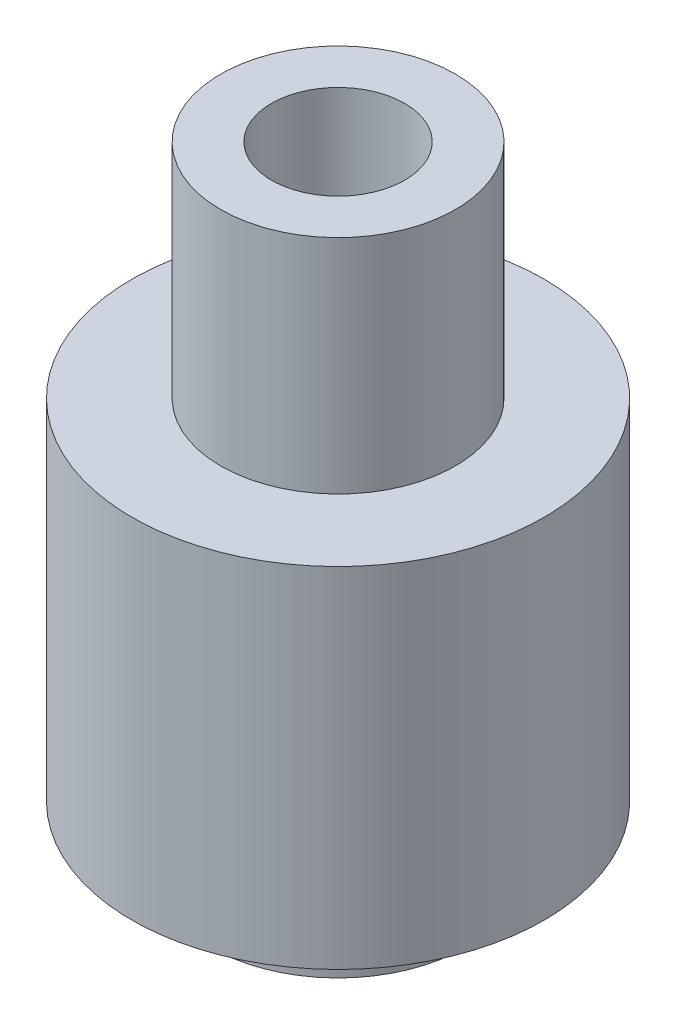
ISO-10303-21;
HEADER;
FILE_DESCRIPTION(('STEP AP214'),'2;1');
FILE_NAME('part.step','',(''),(''),'','','');
FILE_SCHEMA(('AUTOMOTIVE_DESIGN { 1 0 10303 214 1 1 1 1 }'));
ENDSEC;
DATA;
#1=APPLICATION_CONTEXT('core data for automotive mechanical design processes');
#2=APPLICATION_PROTOCOL_DEFINITION('international standard','automotive_design',2000,#1);
#3=PRODUCT_CONTEXT('',#1,'mechanical');
#4=PRODUCT('Part','Part','',(#3));
#5=PRODUCT_RELATED_PRODUCT_CATEGORY('part','',(#4));
#6=PRODUCT_DEFINITION_FORMATION('','',#4);
#7=PRODUCT_DEFINITION_CONTEXT('part definition',#1,'design');
#8=PRODUCT_DEFINITION('design','',#6,#7);
#9=PRODUCT_DEFINITION_SHAPE('','',#8);
#10=(LENGTH_UNIT() NAMED_UNIT(*) SI_UNIT(.MILLI.,.METRE.));
#11=(NAMED_UNIT(*) PLANE_ANGLE_UNIT() SI_UNIT($,.RADIAN.));
#12=(NAMED_UNIT(*) SI_UNIT($,.STERADIAN.) SOLID_ANGLE_UNIT());
#13=UNCERTAINTY_MEASURE_WITH_UNIT(LENGTH_MEASURE(1.E-05),#10,'distance_accuracy_value','');
#14=(GEOMETRIC_REPRESENTATION_CONTEXT(3) GLOBAL_UNCERTAINTY_ASSIGNED_CONTEXT((#13)) GLOBAL_UNIT_ASSIGNED_CONTEXT((#10,
#11,#12)) REPRESENTATION_CONTEXT('',''));
#15=CARTESIAN_POINT('',(0.,0.,0.));
#16=DIRECTION('',(0.,0.,1.));
#17=DIRECTION('',(1.,0.,0.));
#18=AXIS2_PLACEMENT_3D('',#15,#16,#17);
#19=CARTESIAN_POINT('',(4.,-13.,0.));
#20=DIRECTION('',(0.,-1.,0.));
#21=DIRECTION('',(0.,0.,-1.));
#22=AXIS2_PLACEMENT_3D('',#19,#20,#21);
#23=PLANE('',#22);
#24=CARTESIAN_POINT('',(0.,-13.,0.));
#25=DIRECTION('',(0.,-1.,0.));
#26=DIRECTION('',(0.,0.,-1.));
#27=AXIS2_PLACEMENT_3D('',#24,#25,#26);
#28=CIRCLE('',#27,4.);
#29=CARTESIAN_POINT('',(0.,-13.,-4.));
#30=VERTEX_POINT('',#29);
#31=EDGE_CURVE('E63',#30,#30,#28,.T.);
#32=ORIENTED_EDGE('',*,*,#31,.T.);
#33=EDGE_LOOP('',(#32));
#34=FACE_BOUND('',#33,.T.);
#35=CARTESIAN_POINT('',(0.,-13.,0.));
#36=DIRECTION('',(0.,-1.,0.));
#37=DIRECTION('',(0.,0.,-1.));
#38=AXIS2_PLACEMENT_3D('',#35,#36,#37);
#39=CIRCLE('',#38,2.1);
#40=CARTESIAN_POINT('',(0.,-13.,-2.1));
#41=VERTEX_POINT('',#40);
#42=EDGE_CURVE('E10',#41,#41,#39,.T.);
#43=ORIENTED_EDGE('',*,*,#42,.F.);
#44=EDGE_LOOP('',(#43));
#45=FACE_BOUND('',#44,.T.);
#46=ADVANCED_FACE('F35',(#34,#45),#23,.T.);
#47=CARTESIAN_POINT('',(0.,-500.,0.));
#48=DIRECTION('',(0.,-1.,0.));
#49=DIRECTION('',(0.,0.,-1.));
#50=AXIS2_PLACEMENT_3D('',#47,#48,#49);
#51=CYLINDRICAL_SURFACE('',#50,2.1);
#52=ORIENTED_EDGE('',*,*,#42,.T.);
#53=EDGE_LOOP('',(#52));
#54=FACE_BOUND('',#53,.T.);
#55=CARTESIAN_POINT('',(0.,7.00000000000001,0.));
#56=DIRECTION('',(0.,-1.,0.));
#57=DIRECTION('',(0.,0.,-1.));
#58=AXIS2_PLACEMENT_3D('',#55,#56,#57);
#59=CIRCLE('',#58,2.1);
#60=CARTESIAN_POINT('',(0.,7.00000000000001,-2.1));
#61=VERTEX_POINT('',#60);
#62=EDGE_CURVE('E41',#61,#61,#59,.T.);
#63=ORIENTED_EDGE('',*,*,#62,.F.);
#64=EDGE_LOOP('',(#63));
#65=FACE_BOUND('',#64,.T.);
#66=ADVANCED_FACE('F81',(#54,#65),#51,.F.);
#67=CARTESIAN_POINT('',(2.1,7.,0.));
#68=DIRECTION('',(0.,1.,0.));
#69=DIRECTION('',(0.,0.,1.));
#70=AXIS2_PLACEMENT_3D('',#67,#68,#69);
#71=PLANE('',#70);
#72=ORIENTED_EDGE('',*,*,#62,.T.);
#73=EDGE_LOOP('',(#72));
#74=FACE_BOUND('',#73,.T.);
#75=CARTESIAN_POINT('',(0.,7.00000000000001,0.));
#76=DIRECTION('',(0.,-1.,0.));
#77=DIRECTION('',(0.,0.,-1.));
#78=AXIS2_PLACEMENT_3D('',#75,#76,#77);
#79=CIRCLE('',#78,3.7);
#80=CARTESIAN_POINT('',(0.,7.00000000000001,-3.7));
#81=VERTEX_POINT('',#80);
#82=EDGE_CURVE('E45',#81,#81,#79,.T.);
#83=ORIENTED_EDGE('',*,*,#82,.F.);
#84=EDGE_LOOP('',(#83));
#85=FACE_BOUND('',#84,.T.);
#86=ADVANCED_FACE('F85',(#74,#85),#71,.T.);
#87=CARTESIAN_POINT('',(0.,-500.,0.));
#88=DIRECTION('',(0.,-1.,0.));
#89=DIRECTION('',(0.,0.,-1.));
#90=AXIS2_PLACEMENT_3D('',#87,#88,#89);
#91=CYLINDRICAL_SURFACE('',#90,3.7);
#92=ORIENTED_EDGE('',*,*,#82,.T.);
#93=EDGE_LOOP('',(#92));
#94=FACE_BOUND('',#93,.T.);
#95=CARTESIAN_POINT('',(0.,0.,0.));
#96=DIRECTION('',(0.,-1.,0.));
#97=DIRECTION('',(0.,0.,-1.));
#98=AXIS2_PLACEMENT_3D('',#95,#96,#97);
#99=CIRCLE('',#98,3.7);
#100=CARTESIAN_POINT('',(0.,0.,-3.7));
#101=VERTEX_POINT('',#100);
#102=EDGE_CURVE('E49',#101,#101,#99,.T.);
#103=ORIENTED_EDGE('',*,*,#102,.F.);
#104=EDGE_LOOP('',(#103));
#105=FACE_BOUND('',#104,.T.);
#106=ADVANCED_FACE('F89',(#94,#105),#91,.T.);
#107=CARTESIAN_POINT('',(3.7,0.,0.));
#108=DIRECTION('',(0.,1.,0.));
#109=DIRECTION('',(0.,0.,1.));
#110=AXIS2_PLACEMENT_3D('',#107,#108,#109);
#111=PLANE('',#110);
#112=ORIENTED_EDGE('',*,*,#102,.T.);
#113=EDGE_LOOP('',(#112));
#114=FACE_BOUND('',#113,.T.);
#115=CARTESIAN_POINT('',(0.,0.,0.));
#116=DIRECTION('',(0.,-1.,0.));
#117=DIRECTION('',(0.,0.,-1.));
#118=AXIS2_PLACEMENT_3D('',#115,#116,#117);
#119=CIRCLE('',#118,6.5);
#120=CARTESIAN_POINT('',(0.,0.,-6.5));
#121=VERTEX_POINT('',#120);
#122=EDGE_CURVE('E54',#121,#121,#119,.T.);
#123=ORIENTED_EDGE('',*,*,#122,.F.);
#124=EDGE_LOOP('',(#123));
#125=FACE_BOUND('',#124,.T.);
#126=ADVANCED_FACE('F95',(#114,#125),#111,.T.);
#127=CARTESIAN_POINT('',(0.,-500.,0.));
#128=DIRECTION('',(0.,-1.,0.));
#129=DIRECTION('',(0.,0.,-1.));
#130=AXIS2_PLACEMENT_3D('',#127,#128,#129);
#131=CYLINDRICAL_SURFACE('',#130,6.5);
#132=ORIENTED_EDGE('',*,*,#122,.T.);
#133=EDGE_LOOP('',(#132));
#134=FACE_BOUND('',#133,.T.);
#135=CARTESIAN_POINT('',(0.,-11.,0.));
#136=DIRECTION('',(0.,-1.,0.));
#137=DIRECTION('',(0.,0.,-1.));
#138=AXIS2_PLACEMENT_3D('',#135,#136,#137);
#139=CIRCLE('',#138,6.5);
#140=CARTESIAN_POINT('',(0.,-11.,-6.5));
#141=VERTEX_POINT('',#140);
#142=EDGE_CURVE('E57',#141,#141,#139,.T.);
#143=ORIENTED_EDGE('',*,*,#142,.F.);
#144=EDGE_LOOP('',(#143));
#145=FACE_BOUND('',#144,.T.);
#146=ADVANCED_FACE('F77',(#134,#145),#131,.T.);
#147=CARTESIAN_POINT('',(6.5,-11.,0.));
#148=DIRECTION('',(0.,-1.,0.));
#149=DIRECTION('',(0.,0.,-1.));
#150=AXIS2_PLACEMENT_3D('',#147,#148,#149);
#151=PLANE('',#150);
#152=ORIENTED_EDGE('',*,*,#142,.T.);
#153=EDGE_LOOP('',(#152));
#154=FACE_BOUND('',#153,.T.);
#155=CARTESIAN_POINT('',(0.,-11.,0.));
#156=DIRECTION('',(0.,-1.,0.));
#157=DIRECTION('',(0.,0.,-1.));
#158=AXIS2_PLACEMENT_3D('',#155,#156,#157);
#159=CIRCLE('',#158,4.);
#160=CARTESIAN_POINT('',(0.,-11.,-4.));
#161=VERTEX_POINT('',#160);
#162=EDGE_CURVE('E60',#161,#161,#159,.T.);
#163=ORIENTED_EDGE('',*,*,#162,.F.);
#164=EDGE_LOOP('',(#163));
#165=FACE_BOUND('',#164,.T.);
#166=ADVANCED_FACE('F71',(#154,#165),#151,.T.);
#167=CARTESIAN_POINT('',(0.,-500.,0.));
#168=DIRECTION('',(0.,-1.,0.));
#169=DIRECTION('',(0.,0.,-1.));
#170=AXIS2_PLACEMENT_3D('',#167,#168,#169);
#171=CYLINDRICAL_SURFACE('',#170,4.);
#172=ORIENTED_EDGE('',*,*,#162,.T.);
#173=EDGE_LOOP('',(#172));
#174=FACE_BOUND('',#173,.T.);
#175=ORIENTED_EDGE('',*,*,#31,.F.);
#176=EDGE_LOOP('',(#175));
#177=FACE_BOUND('',#176,.T.);
#178=ADVANCED_FACE('F69',(#174,#177),#171,.T.);
#179=CLOSED_SHELL('',(#46,#66,#86,#106,#126,#146,#166,#178));
#180=MANIFOLD_SOLID_BREP('B2',#179);
#181=ADVANCED_BREP_SHAPE_REPRESENTATION('',(#18,#180),#14);
#182=SHAPE_DEFINITION_REPRESENTATION(#9,#181);
ENDSEC;
END-ISO-10303-21;
